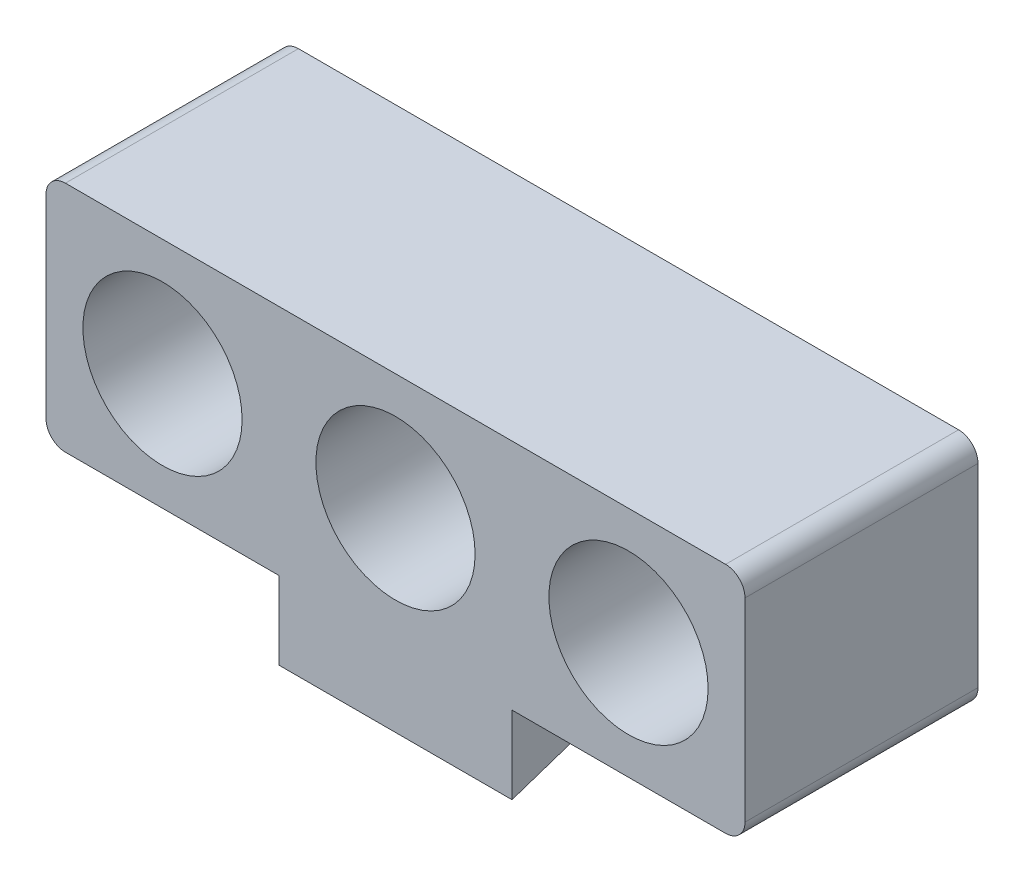
ISO-10303-21;
HEADER;
FILE_DESCRIPTION(('STEP AP214'),'2;1');
FILE_NAME('part.step','',(''),(''),'','','');
FILE_SCHEMA(('AUTOMOTIVE_DESIGN { 1 0 10303 214 1 1 1 1 }'));
ENDSEC;
DATA;
#1=APPLICATION_CONTEXT('core data for automotive mechanical design processes');
#2=APPLICATION_PROTOCOL_DEFINITION('international standard','automotive_design',2000,#1);
#3=PRODUCT_CONTEXT('',#1,'mechanical');
#4=PRODUCT('Part','Part','',(#3));
#5=PRODUCT_RELATED_PRODUCT_CATEGORY('part','',(#4));
#6=PRODUCT_DEFINITION_FORMATION('','',#4);
#7=PRODUCT_DEFINITION_CONTEXT('part definition',#1,'design');
#8=PRODUCT_DEFINITION('design','',#6,#7);
#9=PRODUCT_DEFINITION_SHAPE('','',#8);
#10=(LENGTH_UNIT() NAMED_UNIT(*) SI_UNIT(.MILLI.,.METRE.));
#11=(NAMED_UNIT(*) PLANE_ANGLE_UNIT() SI_UNIT($,.RADIAN.));
#12=(NAMED_UNIT(*) SI_UNIT($,.STERADIAN.) SOLID_ANGLE_UNIT());
#13=UNCERTAINTY_MEASURE_WITH_UNIT(LENGTH_MEASURE(1.E-05),#10,'distance_accuracy_value','');
#14=(GEOMETRIC_REPRESENTATION_CONTEXT(3) GLOBAL_UNCERTAINTY_ASSIGNED_CONTEXT((#13)) GLOBAL_UNIT_ASSIGNED_CONTEXT((#10,
#11,#12)) REPRESENTATION_CONTEXT('',''));
#15=CARTESIAN_POINT('',(0.,0.,0.));
#16=DIRECTION('',(0.,0.,1.));
#17=DIRECTION('',(1.,0.,0.));
#18=AXIS2_PLACEMENT_3D('',#15,#16,#17);
#19=CARTESIAN_POINT('',(18.,-5.99999999999999,12.));
#20=DIRECTION('',(0.,1.,0.));
#21=DIRECTION('',(-1.,0.,0.));
#22=AXIS2_PLACEMENT_3D('',#19,#20,#21);
#23=PLANE('',#22);
#24=DIRECTION('',(1.,0.,0.));
#25=VECTOR('',#24,1.);
#26=CARTESIAN_POINT('',(18.,-5.99999999999999,12.));
#27=LINE('',#26,#25);
#28=CARTESIAN_POINT('',(-17.,-6.,12.));
#29=VERTEX_POINT('',#28);
#30=CARTESIAN_POINT('',(-6.,-6.,12.));
#31=VERTEX_POINT('',#30);
#32=EDGE_CURVE('E185',#29,#31,#27,.T.);
#33=ORIENTED_EDGE('',*,*,#32,.F.);
#34=DIRECTION('',(0.,0.,-1.));
#35=VECTOR('',#34,1.);
#36=CARTESIAN_POINT('',(-17.,-6.,12.));
#37=LINE('',#36,#35);
#38=CARTESIAN_POINT('',(-17.,-6.,0.));
#39=VERTEX_POINT('',#38);
#40=EDGE_CURVE('E125',#29,#39,#37,.T.);
#41=ORIENTED_EDGE('',*,*,#40,.T.);
#42=DIRECTION('',(1.,0.,0.));
#43=VECTOR('',#42,1.);
#44=CARTESIAN_POINT('',(18.,-5.99999999999999,0.));
#45=LINE('',#44,#43);
#46=CARTESIAN_POINT('',(-6.,-6.,0.));
#47=VERTEX_POINT('',#46);
#48=EDGE_CURVE('E118',#39,#47,#45,.T.);
#49=ORIENTED_EDGE('',*,*,#48,.T.);
#50=DIRECTION('',(0.,0.,-1.));
#51=VECTOR('',#50,1.);
#52=CARTESIAN_POINT('',(-6.,-6.,12.));
#53=LINE('',#52,#51);
#54=EDGE_CURVE('E122',#31,#47,#53,.T.);
#55=ORIENTED_EDGE('',*,*,#54,.F.);
#56=EDGE_LOOP('',(#33,#41,#49,#55));
#57=FACE_BOUND('',#56,.T.);
#58=ADVANCED_FACE('F33',(#57),#23,.F.);
#59=CARTESIAN_POINT('',(-18.,-6.,12.));
#60=DIRECTION('',(1.,0.,0.));
#61=DIRECTION('',(0.,0.,-1.));
#62=AXIS2_PLACEMENT_3D('',#59,#60,#61);
#63=PLANE('',#62);
#64=DIRECTION('',(0.,-1.,0.));
#65=VECTOR('',#64,1.);
#66=CARTESIAN_POINT('',(-18.,-6.,0.));
#67=LINE('',#66,#65);
#68=CARTESIAN_POINT('',(-18.,5.,0.));
#69=VERTEX_POINT('',#68);
#70=CARTESIAN_POINT('',(-18.,-5.,0.));
#71=VERTEX_POINT('',#70);
#72=EDGE_CURVE('E179',#69,#71,#67,.T.);
#73=ORIENTED_EDGE('',*,*,#72,.T.);
#74=DIRECTION('',(0.,0.,-1.));
#75=VECTOR('',#74,1.);
#76=CARTESIAN_POINT('',(-18.,-5.,12.));
#77=LINE('',#76,#75);
#78=CARTESIAN_POINT('',(-18.,-5.,12.));
#79=VERTEX_POINT('',#78);
#80=EDGE_CURVE('E11',#71,#79,#77,.F.);
#81=ORIENTED_EDGE('',*,*,#80,.T.);
#82=DIRECTION('',(0.,-1.,0.));
#83=VECTOR('',#82,1.);
#84=CARTESIAN_POINT('',(-18.,-6.,12.));
#85=LINE('',#84,#83);
#86=CARTESIAN_POINT('',(-18.,5.,12.));
#87=VERTEX_POINT('',#86);
#88=EDGE_CURVE('E180',#87,#79,#85,.T.);
#89=ORIENTED_EDGE('',*,*,#88,.F.);
#90=DIRECTION('',(0.,0.,-1.));
#91=VECTOR('',#90,1.);
#92=CARTESIAN_POINT('',(-18.,5.,12.));
#93=LINE('',#92,#91);
#94=EDGE_CURVE('E41',#87,#69,#93,.T.);
#95=ORIENTED_EDGE('',*,*,#94,.T.);
#96=EDGE_LOOP('',(#73,#81,#89,#95));
#97=FACE_BOUND('',#96,.T.);
#98=ADVANCED_FACE('F227',(#97),#63,.F.);
#99=CARTESIAN_POINT('',(6.,-6.,0.));
#100=VERTEX_POINT('',#99);
#101=CARTESIAN_POINT('',(17.,-5.99999999999999,0.));
#102=VERTEX_POINT('',#101);
#103=EDGE_CURVE('E128',#100,#102,#45,.T.);
#104=ORIENTED_EDGE('',*,*,#103,.T.);
#105=DIRECTION('',(0.,0.,-1.));
#106=VECTOR('',#105,1.);
#107=CARTESIAN_POINT('',(17.,-5.99999999999999,12.));
#108=LINE('',#107,#106);
#109=CARTESIAN_POINT('',(17.,-5.99999999999999,12.));
#110=VERTEX_POINT('',#109);
#111=EDGE_CURVE('E209',#102,#110,#108,.F.);
#112=ORIENTED_EDGE('',*,*,#111,.T.);
#113=CARTESIAN_POINT('',(6.,-6.,12.));
#114=VERTEX_POINT('',#113);
#115=EDGE_CURVE('E183',#114,#110,#27,.T.);
#116=ORIENTED_EDGE('',*,*,#115,.F.);
#117=DIRECTION('',(0.,0.,-1.));
#118=VECTOR('',#117,1.);
#119=CARTESIAN_POINT('',(6.,-6.,12.));
#120=LINE('',#119,#118);
#121=EDGE_CURVE('E158',#114,#100,#120,.T.);
#122=ORIENTED_EDGE('',*,*,#121,.T.);
#123=EDGE_LOOP('',(#104,#112,#116,#122));
#124=FACE_BOUND('',#123,.T.);
#125=ADVANCED_FACE('F244',(#124),#23,.F.);
#126=CARTESIAN_POINT('',(18.,-5.99999999999999,12.));
#127=DIRECTION('',(-1.,0.,0.));
#128=DIRECTION('',(0.,0.,1.));
#129=AXIS2_PLACEMENT_3D('',#126,#127,#128);
#130=PLANE('',#129);
#131=DIRECTION('',(0.,1.,0.));
#132=VECTOR('',#131,1.);
#133=CARTESIAN_POINT('',(18.,-5.99999999999999,12.));
#134=LINE('',#133,#132);
#135=CARTESIAN_POINT('',(18.,-4.99999999999999,12.));
#136=VERTEX_POINT('',#135);
#137=CARTESIAN_POINT('',(18.,5.,12.));
#138=VERTEX_POINT('',#137);
#139=EDGE_CURVE('E187',#136,#138,#134,.T.);
#140=ORIENTED_EDGE('',*,*,#139,.F.);
#141=DIRECTION('',(0.,0.,-1.));
#142=VECTOR('',#141,1.);
#143=CARTESIAN_POINT('',(18.,-4.99999999999999,12.));
#144=LINE('',#143,#142);
#145=CARTESIAN_POINT('',(18.,-4.99999999999999,0.));
#146=VERTEX_POINT('',#145);
#147=EDGE_CURVE('E198',#136,#146,#144,.T.);
#148=ORIENTED_EDGE('',*,*,#147,.T.);
#149=DIRECTION('',(0.,1.,0.));
#150=VECTOR('',#149,1.);
#151=CARTESIAN_POINT('',(18.,-5.99999999999999,0.));
#152=LINE('',#151,#150);
#153=CARTESIAN_POINT('',(18.,5.,0.));
#154=VERTEX_POINT('',#153);
#155=EDGE_CURVE('E127',#146,#154,#152,.T.);
#156=ORIENTED_EDGE('',*,*,#155,.T.);
#157=DIRECTION('',(0.,0.,-1.));
#158=VECTOR('',#157,1.);
#159=CARTESIAN_POINT('',(18.,5.,12.));
#160=LINE('',#159,#158);
#161=EDGE_CURVE('E191',#154,#138,#160,.F.);
#162=ORIENTED_EDGE('',*,*,#161,.T.);
#163=EDGE_LOOP('',(#140,#148,#156,#162));
#164=FACE_BOUND('',#163,.T.);
#165=ADVANCED_FACE('F251',(#164),#130,.F.);
#166=CARTESIAN_POINT('',(18.,6.00000000000001,12.));
#167=DIRECTION('',(0.,-1.,0.));
#168=DIRECTION('',(1.,0.,0.));
#169=AXIS2_PLACEMENT_3D('',#166,#167,#168);
#170=PLANE('',#169);
#171=DIRECTION('',(-1.,0.,0.));
#172=VECTOR('',#171,1.);
#173=CARTESIAN_POINT('',(18.,6.00000000000001,12.));
#174=LINE('',#173,#172);
#175=CARTESIAN_POINT('',(17.,6.00000000000001,12.));
#176=VERTEX_POINT('',#175);
#177=CARTESIAN_POINT('',(-17.,6.,12.));
#178=VERTEX_POINT('',#177);
#179=EDGE_CURVE('E189',#176,#178,#174,.T.);
#180=ORIENTED_EDGE('',*,*,#179,.F.);
#181=DIRECTION('',(0.,0.,-1.));
#182=VECTOR('',#181,1.);
#183=CARTESIAN_POINT('',(17.,6.00000000000001,12.));
#184=LINE('',#183,#182);
#185=CARTESIAN_POINT('',(17.,6.00000000000001,0.));
#186=VERTEX_POINT('',#185);
#187=EDGE_CURVE('E219',#176,#186,#184,.T.);
#188=ORIENTED_EDGE('',*,*,#187,.T.);
#189=DIRECTION('',(-1.,0.,0.));
#190=VECTOR('',#189,1.);
#191=CARTESIAN_POINT('',(18.,6.00000000000001,0.));
#192=LINE('',#191,#190);
#193=CARTESIAN_POINT('',(-17.,6.,0.));
#194=VERTEX_POINT('',#193);
#195=EDGE_CURVE('E184',#186,#194,#192,.T.);
#196=ORIENTED_EDGE('',*,*,#195,.T.);
#197=DIRECTION('',(0.,0.,-1.));
#198=VECTOR('',#197,1.);
#199=CARTESIAN_POINT('',(-17.,6.,12.));
#200=LINE('',#199,#198);
#201=EDGE_CURVE('E48',#194,#178,#200,.F.);
#202=ORIENTED_EDGE('',*,*,#201,.T.);
#203=EDGE_LOOP('',(#180,#188,#196,#202));
#204=FACE_BOUND('',#203,.T.);
#205=ADVANCED_FACE('F256',(#204),#170,.F.);
#206=CARTESIAN_POINT('',(0.,0.,12.));
#207=DIRECTION('',(0.,0.,1.));
#208=DIRECTION('',(1.,0.,0.));
#209=AXIS2_PLACEMENT_3D('',#206,#207,#208);
#210=PLANE('',#209);
#211=CARTESIAN_POINT('',(-12.,0.,12.));
#212=DIRECTION('',(0.,0.,1.));
#213=DIRECTION('',(1.,0.,0.));
#214=AXIS2_PLACEMENT_3D('',#211,#212,#213);
#215=CIRCLE('',#214,4.1);
#216=CARTESIAN_POINT('',(-7.9,0.,12.));
#217=VERTEX_POINT('',#216);
#218=EDGE_CURVE('E139',#217,#217,#215,.T.);
#219=ORIENTED_EDGE('',*,*,#218,.F.);
#220=EDGE_LOOP('',(#219));
#221=FACE_BOUND('',#220,.T.);
#222=CARTESIAN_POINT('',(12.,0.,12.));
#223=DIRECTION('',(0.,0.,1.));
#224=DIRECTION('',(1.,0.,0.));
#225=AXIS2_PLACEMENT_3D('',#222,#223,#224);
#226=CIRCLE('',#225,4.1);
#227=CARTESIAN_POINT('',(16.1,0.,12.));
#228=VERTEX_POINT('',#227);
#229=EDGE_CURVE('E167',#228,#228,#226,.T.);
#230=ORIENTED_EDGE('',*,*,#229,.F.);
#231=EDGE_LOOP('',(#230));
#232=FACE_BOUND('',#231,.T.);
#233=CARTESIAN_POINT('',(0.,0.,12.));
#234=DIRECTION('',(0.,0.,1.));
#235=DIRECTION('',(1.,0.,0.));
#236=AXIS2_PLACEMENT_3D('',#233,#234,#235);
#237=CIRCLE('',#236,4.1);
#238=CARTESIAN_POINT('',(4.1,0.,12.));
#239=VERTEX_POINT('',#238);
#240=EDGE_CURVE('E173',#239,#239,#237,.T.);
#241=ORIENTED_EDGE('',*,*,#240,.F.);
#242=EDGE_LOOP('',(#241));
#243=FACE_BOUND('',#242,.T.);
#244=ORIENTED_EDGE('',*,*,#115,.T.);
#245=CARTESIAN_POINT('',(17.,-4.99999999999999,12.));
#246=DIRECTION('',(0.,0.,1.));
#247=DIRECTION('',(1.,0.,0.));
#248=AXIS2_PLACEMENT_3D('',#245,#246,#247);
#249=CIRCLE('',#248,1.);
#250=EDGE_CURVE('E216',#110,#136,#249,.T.);
#251=ORIENTED_EDGE('',*,*,#250,.T.);
#252=ORIENTED_EDGE('',*,*,#139,.T.);
#253=CARTESIAN_POINT('',(17.,5.00000000000001,12.));
#254=DIRECTION('',(0.,0.,1.));
#255=DIRECTION('',(1.,0.,0.));
#256=AXIS2_PLACEMENT_3D('',#253,#254,#255);
#257=CIRCLE('',#256,1.);
#258=EDGE_CURVE('E55',#138,#176,#257,.T.);
#259=ORIENTED_EDGE('',*,*,#258,.T.);
#260=ORIENTED_EDGE('',*,*,#179,.T.);
#261=CARTESIAN_POINT('',(-17.,5.,12.));
#262=DIRECTION('',(0.,0.,1.));
#263=DIRECTION('',(1.,0.,0.));
#264=AXIS2_PLACEMENT_3D('',#261,#262,#263);
#265=CIRCLE('',#264,1.);
#266=EDGE_CURVE('E211',#178,#87,#265,.T.);
#267=ORIENTED_EDGE('',*,*,#266,.T.);
#268=ORIENTED_EDGE('',*,*,#88,.T.);
#269=CARTESIAN_POINT('',(-17.,-5.,12.));
#270=DIRECTION('',(0.,0.,1.));
#271=DIRECTION('',(1.,0.,0.));
#272=AXIS2_PLACEMENT_3D('',#269,#270,#271);
#273=CIRCLE('',#272,1.);
#274=EDGE_CURVE('E213',#79,#29,#273,.T.);
#275=ORIENTED_EDGE('',*,*,#274,.T.);
#276=ORIENTED_EDGE('',*,*,#32,.T.);
#277=DIRECTION('',(0.,1.,0.));
#278=VECTOR('',#277,1.);
#279=CARTESIAN_POINT('',(-6.,-6.,12.));
#280=LINE('',#279,#278);
#281=CARTESIAN_POINT('',(-6.,-10.,12.));
#282=VERTEX_POINT('',#281);
#283=EDGE_CURVE('E148',#282,#31,#280,.T.);
#284=ORIENTED_EDGE('',*,*,#283,.F.);
#285=DIRECTION('',(1.,0.,0.));
#286=VECTOR('',#285,1.);
#287=CARTESIAN_POINT('',(-6.,-10.,12.));
#288=LINE('',#287,#286);
#289=CARTESIAN_POINT('',(6.,-10.,12.));
#290=VERTEX_POINT('',#289);
#291=EDGE_CURVE('E140',#282,#290,#288,.T.);
#292=ORIENTED_EDGE('',*,*,#291,.T.);
#293=DIRECTION('',(0.,1.,0.));
#294=VECTOR('',#293,1.);
#295=CARTESIAN_POINT('',(6.,-6.,12.));
#296=LINE('',#295,#294);
#297=EDGE_CURVE('E151',#290,#114,#296,.T.);
#298=ORIENTED_EDGE('',*,*,#297,.T.);
#299=EDGE_LOOP('',(#244,#251,#252,#259,#260,#267,#268,#275,#276,#284,#292,#298));
#300=FACE_BOUND('',#299,.T.);
#301=ADVANCED_FACE('F236',(#221,#232,#243,#300),#210,.T.);
#302=CARTESIAN_POINT('',(0.,0.,0.));
#303=DIRECTION('',(0.,0.,1.));
#304=DIRECTION('',(1.,0.,0.));
#305=AXIS2_PLACEMENT_3D('',#302,#303,#304);
#306=PLANE('',#305);
#307=CARTESIAN_POINT('',(-12.,0.,0.));
#308=DIRECTION('',(0.,0.,1.));
#309=DIRECTION('',(1.,0.,0.));
#310=AXIS2_PLACEMENT_3D('',#307,#308,#309);
#311=CIRCLE('',#310,4.1);
#312=CARTESIAN_POINT('',(-7.9,0.,0.));
#313=VERTEX_POINT('',#312);
#314=EDGE_CURVE('E164',#313,#313,#311,.T.);
#315=ORIENTED_EDGE('',*,*,#314,.T.);
#316=EDGE_LOOP('',(#315));
#317=FACE_BOUND('',#316,.T.);
#318=CARTESIAN_POINT('',(12.,0.,0.));
#319=DIRECTION('',(0.,0.,1.));
#320=DIRECTION('',(1.,0.,0.));
#321=AXIS2_PLACEMENT_3D('',#318,#319,#320);
#322=CIRCLE('',#321,4.1);
#323=CARTESIAN_POINT('',(16.1,0.,0.));
#324=VERTEX_POINT('',#323);
#325=EDGE_CURVE('E170',#324,#324,#322,.T.);
#326=ORIENTED_EDGE('',*,*,#325,.T.);
#327=EDGE_LOOP('',(#326));
#328=FACE_BOUND('',#327,.T.);
#329=CARTESIAN_POINT('',(0.,0.,0.));
#330=DIRECTION('',(0.,0.,1.));
#331=DIRECTION('',(1.,0.,0.));
#332=AXIS2_PLACEMENT_3D('',#329,#330,#331);
#333=CIRCLE('',#332,4.1);
#334=CARTESIAN_POINT('',(4.1,0.,0.));
#335=VERTEX_POINT('',#334);
#336=EDGE_CURVE('E176',#335,#335,#333,.T.);
#337=ORIENTED_EDGE('',*,*,#336,.T.);
#338=EDGE_LOOP('',(#337));
#339=FACE_BOUND('',#338,.T.);
#340=ORIENTED_EDGE('',*,*,#155,.F.);
#341=CARTESIAN_POINT('',(17.,-4.99999999999999,0.));
#342=DIRECTION('',(0.,0.,1.));
#343=DIRECTION('',(1.,0.,0.));
#344=AXIS2_PLACEMENT_3D('',#341,#342,#343);
#345=CIRCLE('',#344,1.);
#346=EDGE_CURVE('E207',#146,#102,#345,.F.);
#347=ORIENTED_EDGE('',*,*,#346,.T.);
#348=ORIENTED_EDGE('',*,*,#103,.F.);
#349=DIRECTION('',(1.,0.,0.));
#350=VECTOR('',#349,1.);
#351=CARTESIAN_POINT('',(-6.,-6.,0.));
#352=LINE('',#351,#350);
#353=EDGE_CURVE('E132',#47,#100,#352,.T.);
#354=ORIENTED_EDGE('',*,*,#353,.F.);
#355=ORIENTED_EDGE('',*,*,#48,.F.);
#356=CARTESIAN_POINT('',(-17.,-5.,0.));
#357=DIRECTION('',(0.,0.,1.));
#358=DIRECTION('',(1.,0.,0.));
#359=AXIS2_PLACEMENT_3D('',#356,#357,#358);
#360=CIRCLE('',#359,1.);
#361=EDGE_CURVE('E203',#39,#71,#360,.F.);
#362=ORIENTED_EDGE('',*,*,#361,.T.);
#363=ORIENTED_EDGE('',*,*,#72,.F.);
#364=CARTESIAN_POINT('',(-17.,5.,0.));
#365=DIRECTION('',(0.,0.,1.));
#366=DIRECTION('',(1.,0.,0.));
#367=AXIS2_PLACEMENT_3D('',#364,#365,#366);
#368=CIRCLE('',#367,1.);
#369=EDGE_CURVE('E201',#69,#194,#368,.F.);
#370=ORIENTED_EDGE('',*,*,#369,.T.);
#371=ORIENTED_EDGE('',*,*,#195,.F.);
#372=CARTESIAN_POINT('',(17.,5.00000000000001,0.));
#373=DIRECTION('',(0.,0.,1.));
#374=DIRECTION('',(1.,0.,0.));
#375=AXIS2_PLACEMENT_3D('',#372,#373,#374);
#376=CIRCLE('',#375,1.);
#377=EDGE_CURVE('E205',#186,#154,#376,.F.);
#378=ORIENTED_EDGE('',*,*,#377,.T.);
#379=EDGE_LOOP('',(#340,#347,#348,#354,#355,#362,#363,#370,#371,#378));
#380=FACE_BOUND('',#379,.T.);
#381=ADVANCED_FACE('F135',(#317,#328,#339,#380),#306,.F.);
#382=CARTESIAN_POINT('',(0.,0.,12.));
#383=DIRECTION('',(0.,0.,1.));
#384=DIRECTION('',(1.,0.,0.));
#385=AXIS2_PLACEMENT_3D('',#382,#383,#384);
#386=CYLINDRICAL_SURFACE('',#385,4.1);
#387=ORIENTED_EDGE('',*,*,#336,.F.);
#388=EDGE_LOOP('',(#387));
#389=FACE_BOUND('',#388,.T.);
#390=ORIENTED_EDGE('',*,*,#240,.T.);
#391=EDGE_LOOP('',(#390));
#392=FACE_BOUND('',#391,.T.);
#393=ADVANCED_FACE('F277',(#389,#392),#386,.F.);
#394=CARTESIAN_POINT('',(12.,0.,12.));
#395=DIRECTION('',(0.,0.,1.));
#396=DIRECTION('',(1.,0.,0.));
#397=AXIS2_PLACEMENT_3D('',#394,#395,#396);
#398=CYLINDRICAL_SURFACE('',#397,4.1);
#399=ORIENTED_EDGE('',*,*,#325,.F.);
#400=EDGE_LOOP('',(#399));
#401=FACE_BOUND('',#400,.T.);
#402=ORIENTED_EDGE('',*,*,#229,.T.);
#403=EDGE_LOOP('',(#402));
#404=FACE_BOUND('',#403,.T.);
#405=ADVANCED_FACE('F282',(#401,#404),#398,.F.);
#406=CARTESIAN_POINT('',(-12.,0.,12.));
#407=DIRECTION('',(0.,0.,1.));
#408=DIRECTION('',(1.,0.,0.));
#409=AXIS2_PLACEMENT_3D('',#406,#407,#408);
#410=CYLINDRICAL_SURFACE('',#409,4.1);
#411=ORIENTED_EDGE('',*,*,#314,.F.);
#412=EDGE_LOOP('',(#411));
#413=FACE_BOUND('',#412,.T.);
#414=ORIENTED_EDGE('',*,*,#218,.T.);
#415=EDGE_LOOP('',(#414));
#416=FACE_BOUND('',#415,.T.);
#417=ADVANCED_FACE('F286',(#413,#416),#410,.F.);
#418=CARTESIAN_POINT('',(-6.,-10.,12.));
#419=DIRECTION('',(0.,0.948683298050514,0.316227766016838));
#420=DIRECTION('',(0.,-0.316227766016838,0.948683298050514));
#421=AXIS2_PLACEMENT_3D('',#418,#419,#420);
#422=PLANE('',#421);
#423=DIRECTION('',(0.,-0.316227766016838,0.948683298050514));
#424=VECTOR('',#423,1.);
#425=CARTESIAN_POINT('',(6.,-10.,12.));
#426=LINE('',#425,#424);
#427=EDGE_CURVE('E154',#100,#290,#426,.T.);
#428=ORIENTED_EDGE('',*,*,#427,.T.);
#429=ORIENTED_EDGE('',*,*,#291,.F.);
#430=DIRECTION('',(0.,-0.316227766016838,0.948683298050514));
#431=VECTOR('',#430,1.);
#432=CARTESIAN_POINT('',(-6.,-10.,12.));
#433=LINE('',#432,#431);
#434=EDGE_CURVE('E143',#47,#282,#433,.T.);
#435=ORIENTED_EDGE('',*,*,#434,.F.);
#436=ORIENTED_EDGE('',*,*,#353,.T.);
#437=EDGE_LOOP('',(#428,#429,#435,#436));
#438=FACE_BOUND('',#437,.T.);
#439=ADVANCED_FACE('F144',(#438),#422,.F.);
#440=CARTESIAN_POINT('',(-6.,0.,0.));
#441=DIRECTION('',(-1.,0.,0.));
#442=DIRECTION('',(0.,0.,1.));
#443=AXIS2_PLACEMENT_3D('',#440,#441,#442);
#444=PLANE('',#443);
#445=ORIENTED_EDGE('',*,*,#54,.T.);
#446=ORIENTED_EDGE('',*,*,#434,.T.);
#447=ORIENTED_EDGE('',*,*,#283,.T.);
#448=EDGE_LOOP('',(#445,#446,#447));
#449=FACE_BOUND('',#448,.T.);
#450=ADVANCED_FACE('F150',(#449),#444,.T.);
#451=CARTESIAN_POINT('',(6.,0.,0.));
#452=DIRECTION('',(-1.,0.,0.));
#453=DIRECTION('',(0.,0.,1.));
#454=AXIS2_PLACEMENT_3D('',#451,#452,#453);
#455=PLANE('',#454);
#456=ORIENTED_EDGE('',*,*,#121,.F.);
#457=ORIENTED_EDGE('',*,*,#297,.F.);
#458=ORIENTED_EDGE('',*,*,#427,.F.);
#459=EDGE_LOOP('',(#456,#457,#458));
#460=FACE_BOUND('',#459,.T.);
#461=ADVANCED_FACE('F293',(#460),#455,.F.);
#462=CARTESIAN_POINT('',(17.,-4.99999999999999,12.));
#463=DIRECTION('',(0.,0.,-1.));
#464=DIRECTION('',(-1.,0.,0.));
#465=AXIS2_PLACEMENT_3D('',#462,#463,#464);
#466=CYLINDRICAL_SURFACE('',#465,1.);
#467=ORIENTED_EDGE('',*,*,#250,.F.);
#468=ORIENTED_EDGE('',*,*,#111,.F.);
#469=ORIENTED_EDGE('',*,*,#346,.F.);
#470=ORIENTED_EDGE('',*,*,#147,.F.);
#471=EDGE_LOOP('',(#467,#468,#469,#470));
#472=FACE_BOUND('',#471,.T.);
#473=ADVANCED_FACE('F262',(#472),#466,.T.);
#474=CARTESIAN_POINT('',(17.,5.00000000000001,12.));
#475=DIRECTION('',(0.,0.,-1.));
#476=DIRECTION('',(-1.,0.,0.));
#477=AXIS2_PLACEMENT_3D('',#474,#475,#476);
#478=CYLINDRICAL_SURFACE('',#477,1.);
#479=ORIENTED_EDGE('',*,*,#258,.F.);
#480=ORIENTED_EDGE('',*,*,#161,.F.);
#481=ORIENTED_EDGE('',*,*,#377,.F.);
#482=ORIENTED_EDGE('',*,*,#187,.F.);
#483=EDGE_LOOP('',(#479,#480,#481,#482));
#484=FACE_BOUND('',#483,.T.);
#485=ADVANCED_FACE('F241',(#484),#478,.T.);
#486=CARTESIAN_POINT('',(-17.,-5.,12.));
#487=DIRECTION('',(0.,0.,-1.));
#488=DIRECTION('',(-1.,0.,0.));
#489=AXIS2_PLACEMENT_3D('',#486,#487,#488);
#490=CYLINDRICAL_SURFACE('',#489,1.);
#491=ORIENTED_EDGE('',*,*,#274,.F.);
#492=ORIENTED_EDGE('',*,*,#80,.F.);
#493=ORIENTED_EDGE('',*,*,#361,.F.);
#494=ORIENTED_EDGE('',*,*,#40,.F.);
#495=EDGE_LOOP('',(#491,#492,#493,#494));
#496=FACE_BOUND('',#495,.T.);
#497=ADVANCED_FACE('F234',(#496),#490,.T.);
#498=CARTESIAN_POINT('',(-17.,5.,12.));
#499=DIRECTION('',(0.,0.,-1.));
#500=DIRECTION('',(-1.,0.,0.));
#501=AXIS2_PLACEMENT_3D('',#498,#499,#500);
#502=CYLINDRICAL_SURFACE('',#501,1.);
#503=ORIENTED_EDGE('',*,*,#266,.F.);
#504=ORIENTED_EDGE('',*,*,#201,.F.);
#505=ORIENTED_EDGE('',*,*,#369,.F.);
#506=ORIENTED_EDGE('',*,*,#94,.F.);
#507=EDGE_LOOP('',(#503,#504,#505,#506));
#508=FACE_BOUND('',#507,.T.);
#509=ADVANCED_FACE('F35',(#508),#502,.T.);
#510=CLOSED_SHELL('',(#58,#98,#125,#165,#205,#301,#381,#393,#405,#417,#439,#450,#461,#473,#485,
#497,#509));
#511=MANIFOLD_SOLID_BREP('B2',#510);
#512=ADVANCED_BREP_SHAPE_REPRESENTATION('',(#18,#511),#14);
#513=SHAPE_DEFINITION_REPRESENTATION(#9,#512);
ENDSEC;
END-ISO-10303-21;
